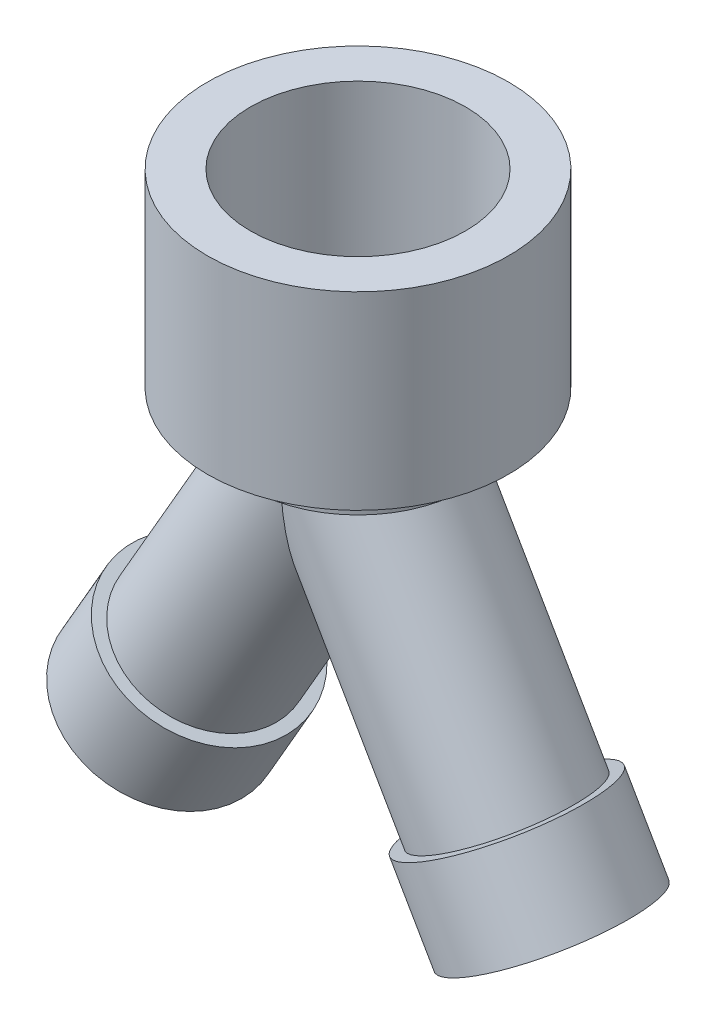
ISO-10303-21;
HEADER;
FILE_DESCRIPTION(('STEP AP214'),'2;1');
FILE_NAME('part.step','',(''),(''),'','','');
FILE_SCHEMA(('AUTOMOTIVE_DESIGN { 1 0 10303 214 1 1 1 1 }'));
ENDSEC;
DATA;
#1=APPLICATION_CONTEXT('core data for automotive mechanical design processes');
#2=APPLICATION_PROTOCOL_DEFINITION('international standard','automotive_design',2000,#1);
#3=PRODUCT_CONTEXT('',#1,'mechanical');
#4=PRODUCT('Part','Part','',(#3));
#5=PRODUCT_RELATED_PRODUCT_CATEGORY('part','',(#4));
#6=PRODUCT_DEFINITION_FORMATION('','',#4);
#7=PRODUCT_DEFINITION_CONTEXT('part definition',#1,'design');
#8=PRODUCT_DEFINITION('design','',#6,#7);
#9=PRODUCT_DEFINITION_SHAPE('','',#8);
#10=(LENGTH_UNIT() NAMED_UNIT(*) SI_UNIT(.MILLI.,.METRE.));
#11=(NAMED_UNIT(*) PLANE_ANGLE_UNIT() SI_UNIT($,.RADIAN.));
#12=(NAMED_UNIT(*) SI_UNIT($,.STERADIAN.) SOLID_ANGLE_UNIT());
#13=UNCERTAINTY_MEASURE_WITH_UNIT(LENGTH_MEASURE(1.E-05),#10,'distance_accuracy_value','');
#14=(GEOMETRIC_REPRESENTATION_CONTEXT(3) GLOBAL_UNCERTAINTY_ASSIGNED_CONTEXT((#13)) GLOBAL_UNIT_ASSIGNED_CONTEXT((#10,
#11,#12)) REPRESENTATION_CONTEXT('',''));
#15=CARTESIAN_POINT('',(0.,0.,0.));
#16=DIRECTION('',(0.,0.,1.));
#17=DIRECTION('',(1.,0.,0.));
#18=AXIS2_PLACEMENT_3D('',#15,#16,#17);
#19=CARTESIAN_POINT('',(0.,-7.62,0.));
#20=DIRECTION('',(-0.500000000000001,0.866025403784438,0.));
#21=DIRECTION('',(0.866025403784438,0.500000000000001,0.));
#22=AXIS2_PLACEMENT_3D('',#19,#20,#21);
#23=CYLINDRICAL_SURFACE('',#22,11.43);
#24=CARTESIAN_POINT('',(0.,-7.62,0.));
#25=DIRECTION('',(0.,-1.,0.));
#26=DIRECTION('',(-1.,0.,0.));
#27=AXIS2_PLACEMENT_3D('',#24,#25,#26);
#28=ELLIPSE('',#27,13.1982271536749,11.43);
#29=CARTESIAN_POINT('',(0.,-7.62,-11.43));
#30=VERTEX_POINT('',#29);
#31=CARTESIAN_POINT('',(0.,-7.62000000000002,11.43));
#32=VERTEX_POINT('',#31);
#33=EDGE_CURVE('E86',#30,#32,#28,.T.);
#34=ORIENTED_EDGE('',*,*,#33,.T.);
#35=CARTESIAN_POINT('',(0.,-7.62,0.));
#36=DIRECTION('',(1.,0.,0.));
#37=DIRECTION('',(0.,1.,0.));
#38=AXIS2_PLACEMENT_3D('',#35,#36,#37);
#39=ELLIPSE('',#38,22.86,11.43);
#40=EDGE_CURVE('E91',#32,#30,#39,.T.);
#41=ORIENTED_EDGE('',*,*,#40,.T.);
#42=EDGE_LOOP('',(#34,#41));
#43=FACE_BOUND('',#42,.T.);
#44=CARTESIAN_POINT('',(21.9710000000001,-45.6748882930958,0.));
#45=DIRECTION('',(-0.500000000000001,0.866025403784438,0.));
#46=DIRECTION('',(-0.866025403784438,-0.500000000000001,0.));
#47=AXIS2_PLACEMENT_3D('',#44,#45,#46);
#48=CIRCLE('',#47,11.43);
#49=CARTESIAN_POINT('',(12.0723296347439,-51.3898882930958,0.));
#50=VERTEX_POINT('',#49);
#51=EDGE_CURVE('E347',#50,#50,#48,.T.);
#52=ORIENTED_EDGE('',*,*,#51,.T.);
#53=EDGE_LOOP('',(#52));
#54=FACE_BOUND('',#53,.T.);
#55=ADVANCED_FACE('F34',(#43,#54),#23,.T.);
#56=CARTESIAN_POINT('',(0.,-7.62,0.));
#57=DIRECTION('',(0.500000000000001,0.866025403784438,0.));
#58=DIRECTION('',(-0.866025403784438,0.500000000000001,0.));
#59=AXIS2_PLACEMENT_3D('',#56,#57,#58);
#60=CYLINDRICAL_SURFACE('',#59,11.43);
#61=ORIENTED_EDGE('',*,*,#40,.F.);
#62=CARTESIAN_POINT('',(0.,-7.62,0.));
#63=DIRECTION('',(0.,-1.,0.));
#64=DIRECTION('',(1.,0.,0.));
#65=AXIS2_PLACEMENT_3D('',#62,#63,#64);
#66=ELLIPSE('',#65,13.1982271536749,11.43);
#67=EDGE_CURVE('E82',#32,#30,#66,.T.);
#68=ORIENTED_EDGE('',*,*,#67,.T.);
#69=EDGE_LOOP('',(#61,#68));
#70=FACE_BOUND('',#69,.T.);
#71=CARTESIAN_POINT('',(-21.9710000000001,-45.6748882930958,0.));
#72=DIRECTION('',(-0.500000000000001,-0.866025403784438,0.));
#73=DIRECTION('',(0.866025403784438,-0.500000000000001,0.));
#74=AXIS2_PLACEMENT_3D('',#71,#72,#73);
#75=CIRCLE('',#74,11.43);
#76=CARTESIAN_POINT('',(-12.0723296347439,-51.3898882930958,0.));
#77=VERTEX_POINT('',#76);
#78=EDGE_CURVE('E95',#77,#77,#75,.T.);
#79=ORIENTED_EDGE('',*,*,#78,.F.);
#80=EDGE_LOOP('',(#79));
#81=FACE_BOUND('',#80,.T.);
#82=ADVANCED_FACE('F92',(#70,#81),#60,.T.);
#83=CARTESIAN_POINT('',(0.,-7.62,0.));
#84=DIRECTION('',(0.,-1.,0.));
#85=DIRECTION('',(0.,0.,-1.));
#86=AXIS2_PLACEMENT_3D('',#83,#84,#85);
#87=PLANE('',#86);
#88=CARTESIAN_POINT('',(0.,-7.62,0.));
#89=DIRECTION('',(0.,-1.,0.));
#90=DIRECTION('',(0.,0.,-1.));
#91=AXIS2_PLACEMENT_3D('',#88,#89,#90);
#92=CIRCLE('',#91,15.875);
#93=CARTESIAN_POINT('',(0.,-7.62,-15.875));
#94=VERTEX_POINT('',#93);
#95=EDGE_CURVE('E122',#94,#94,#92,.T.);
#96=ORIENTED_EDGE('',*,*,#95,.T.);
#97=EDGE_LOOP('',(#96));
#98=FACE_BOUND('',#97,.T.);
#99=ORIENTED_EDGE('',*,*,#33,.F.);
#100=ORIENTED_EDGE('',*,*,#67,.F.);
#101=EDGE_LOOP('',(#99,#100));
#102=FACE_BOUND('',#101,.T.);
#103=ADVANCED_FACE('F84',(#98,#102),#87,.T.);
#104=CARTESIAN_POINT('',(0.,-7.62,0.));
#105=DIRECTION('',(0.,-1.,0.));
#106=DIRECTION('',(-1.,0.,0.));
#107=AXIS2_PLACEMENT_3D('',#104,#105,#106);
#108=ELLIPSE('',#107,8.7988181024499,7.62);
#109=CARTESIAN_POINT('',(0.,-7.62,7.62));
#110=VERTEX_POINT('',#109);
#111=CARTESIAN_POINT('',(0.,-7.62,-7.62));
#112=VERTEX_POINT('',#111);
#113=EDGE_CURVE('E98',#110,#112,#108,.F.);
#114=ORIENTED_EDGE('',*,*,#113,.F.);
#115=CARTESIAN_POINT('',(0.,-7.62,0.));
#116=DIRECTION('',(0.,-1.,0.));
#117=DIRECTION('',(1.,0.,0.));
#118=AXIS2_PLACEMENT_3D('',#115,#116,#117);
#119=ELLIPSE('',#118,8.7988181024499,7.62);
#120=EDGE_CURVE('E54',#112,#110,#119,.F.);
#121=ORIENTED_EDGE('',*,*,#120,.F.);
#122=EDGE_LOOP('',(#114,#121));
#123=FACE_BOUND('',#122,.T.);
#124=ADVANCED_FACE('F215',(#123),#87,.T.);
#125=CARTESIAN_POINT('',(0.,-7.62,0.));
#126=DIRECTION('',(0.500000000000001,0.866025403784438,0.));
#127=DIRECTION('',(-0.866025403784438,0.500000000000001,0.));
#128=AXIS2_PLACEMENT_3D('',#125,#126,#127);
#129=CYLINDRICAL_SURFACE('',#128,7.62);
#130=CARTESIAN_POINT('',(-8.51941899427419,-12.5386888496834,-5.81987113259394));
#131=CARTESIAN_POINT('',(-8.40017942948958,-12.6075320668946,-5.93627103688453));
#132=CARTESIAN_POINT('',(-8.2785579120609,-12.6806397600646,-6.04777155656926));
#133=CARTESIAN_POINT('',(-8.0319777803417,-12.8359990953302,-6.26040021709131));
#134=CARTESIAN_POINT('',(-7.90701714628562,-12.9182563715162,-6.36152189238391));
#135=CARTESIAN_POINT('',(-7.65531876025398,-13.0924586329775,-6.55268735287305));
#136=CARTESIAN_POINT('',(-7.52858075353579,-13.1844050195082,-6.64272953164105));
#137=CARTESIAN_POINT('',(-7.27505864616871,-13.3783163962796,-6.81114687420383));
#138=CARTESIAN_POINT('',(-7.14827456321832,-13.4802790397259,-6.88952476015316));
#139=CARTESIAN_POINT('',(-6.89579272943722,-13.6948307214968,-7.03455580648421));
#140=CARTESIAN_POINT('',(-6.77010267233761,-13.8074665432574,-7.10115329814647));
#141=CARTESIAN_POINT('',(-6.5221335170095,-14.0427129984152,-7.22196737448821));
#142=CARTESIAN_POINT('',(-6.39985459781527,-14.1653241540521,-7.27618331038847));
#143=CARTESIAN_POINT('',(-6.16049526228697,-14.4196452664246,-7.37218712362938));
#144=CARTESIAN_POINT('',(-6.04340564854408,-14.551337973402,-7.41399780391877));
#145=CARTESIAN_POINT('',(-5.81542781439078,-14.823061112812,-7.48564455094343));
#146=CARTESIAN_POINT('',(-5.70453949831271,-14.9630914165513,-7.51548080245253));
#147=CARTESIAN_POINT('',(-5.49488735856831,-15.2435182801368,-7.56259628753768));
#148=CARTESIAN_POINT('',(-5.39579815125564,-15.3835843568723,-7.58040262331333));
#149=CARTESIAN_POINT('',(-5.20440232065841,-15.6690868560957,-7.6062780458078));
#150=CARTESIAN_POINT('',(-5.11209542714253,-15.8145230642711,-7.61434752067531));
#151=CARTESIAN_POINT('',(-4.84523755877699,-16.2577386246212,-7.62499409428589));
#152=CARTESIAN_POINT('',(-4.68095695406543,-16.5621439558835,-7.61396553064916));
#153=CARTESIAN_POINT('',(-4.40111607242368,-17.1336069626633,-7.56506106570286));
#154=CARTESIAN_POINT('',(-4.28194504063687,-17.3993486486677,-7.53149871250967));
#155=CARTESIAN_POINT('',(-4.05977193520259,-17.934534346516,-7.44479538761356));
#156=CARTESIAN_POINT('',(-3.95678052485687,-18.2039806737919,-7.39164158057976));
#157=CARTESIAN_POINT('',(-3.76455435244691,-18.7443751019539,-7.2675249486645));
#158=CARTESIAN_POINT('',(-3.67535436660525,-19.0153252703397,-7.1965182519986));
#159=CARTESIAN_POINT('',(-3.50888471265602,-19.5559535217516,-7.03799927220274));
#160=CARTESIAN_POINT('',(-3.43161268965761,-19.8256318456547,-6.9504902546598));
#161=CARTESIAN_POINT('',(-3.28305357814247,-20.3772502333311,-6.75415395469521));
#162=CARTESIAN_POINT('',(-3.21235490111182,-20.6590177504815,-6.64439876071401));
#163=CARTESIAN_POINT('',(-3.08045128484155,-21.2173476343578,-6.40723150190542));
#164=CARTESIAN_POINT('',(-3.01924787539957,-21.4939091560439,-6.27981659814214));
#165=CARTESIAN_POINT('',(-2.9050525591312,-22.0393022785146,-6.00713359392627));
#166=CARTESIAN_POINT('',(-2.8520482896504,-22.3081450091881,-5.86189297602301));
#167=CARTESIAN_POINT('',(-2.75309663345149,-22.8360746242365,-5.55256166840523));
#168=CARTESIAN_POINT('',(-2.70714702294742,-23.0951645633901,-5.38847694739952));
#169=CARTESIAN_POINT('',(-2.63391869310217,-23.5274439586179,-5.0905660251703));
#170=CARTESIAN_POINT('',(-2.60508360497737,-23.7038049509703,-4.96171404207057));
#171=CARTESIAN_POINT('',(-2.55040203058366,-24.0486481332719,-4.69330664692774));
#172=CARTESIAN_POINT('',(-2.52455490400012,-24.2171320066468,-4.55375353881789));
#173=CARTESIAN_POINT('',(-2.4757296131572,-24.5444574693886,-4.26340166219648));
#174=CARTESIAN_POINT('',(-2.45274981930812,-24.7033045090327,-4.11260935981211));
#175=CARTESIAN_POINT('',(-2.40959866978484,-25.0092318032009,-3.79927002573292));
#176=CARTESIAN_POINT('',(-2.38942654747967,-25.1563152650699,-3.636726221261));
#177=CARTESIAN_POINT('',(-2.34228143545645,-25.5078496805895,-3.21291902696543));
#178=CARTESIAN_POINT('',(-2.31709694260628,-25.7032332287429,-2.94363585052347));
#179=CARTESIAN_POINT('',(-2.28444395454271,-25.9629441305366,-2.51926877659305));
#180=CARTESIAN_POINT('',(-2.27441513730816,-26.0439403140501,-2.37443828308655));
#181=CARTESIAN_POINT('',(-2.25613560171803,-26.1932140071708,-2.07829408965303));
#182=CARTESIAN_POINT('',(-2.24788369038468,-26.2615000459022,-1.92698482177491));
#183=CARTESIAN_POINT('',(-2.23465866880768,-26.3718929656371,-1.64837089416059));
#184=CARTESIAN_POINT('',(-2.22936011718093,-26.4165088210217,-1.52207251049131));
#185=CARTESIAN_POINT('',(-2.22002668231745,-26.4955328344641,-1.26632079404892));
#186=CARTESIAN_POINT('',(-2.21599118276735,-26.5299459705625,-1.13686903332569));
#187=CARTESIAN_POINT('',(-2.20922657732926,-26.5878476087961,-0.875560906028385));
#188=CARTESIAN_POINT('',(-2.20649689184307,-26.6113409576529,-0.743705633305396));
#189=CARTESIAN_POINT('',(-2.20237496742531,-26.6468846116194,-0.478430953745714));
#190=CARTESIAN_POINT('',(-2.20098274068815,-26.6589348123949,-0.345011532658952));
#191=CARTESIAN_POINT('',(-2.19955266904437,-26.6713131334057,-0.0772668733876903));
#192=CARTESIAN_POINT('',(-2.19951840061059,-26.6716102995133,0.0570598249673243));
#193=CARTESIAN_POINT('',(-2.20081361479246,-26.660398272781,0.325208860330016));
#194=CARTESIAN_POINT('',(-2.20214310177991,-26.6488890420932,0.459031195719471));
#195=CARTESIAN_POINT('',(-2.20614877022777,-26.6143384858591,0.725183394161435));
#196=CARTESIAN_POINT('',(-2.20882521842862,-26.5912948761498,0.857512956289216));
#197=CARTESIAN_POINT('',(-2.21549077442589,-26.5342189804016,1.11976572463905));
#198=CARTESIAN_POINT('',(-2.21948042386641,-26.5001821602023,1.24968791451812));
#199=CARTESIAN_POINT('',(-2.23310158327126,-26.3847873950189,1.6275371419668));
#200=CARTESIAN_POINT('',(-2.24450446757909,-26.2890827703448,1.8711348361194));
#201=CARTESIAN_POINT('',(-2.2717441211475,-26.0652349129426,2.34230555727956));
#202=CARTESIAN_POINT('',(-2.28758272732988,-25.9370782432803,2.56987189641185));
#203=CARTESIAN_POINT('',(-2.33511712496581,-25.562342070231,3.15095627171628));
#204=CARTESIAN_POINT('',(-2.37041332890216,-25.2930857499475,3.48966296712925));
#205=CARTESIAN_POINT('',(-2.43137822175831,-24.8535862888172,3.96264517824189));
#206=CARTESIAN_POINT('',(-2.45308242647192,-24.7008469287992,4.11469874976094));
#207=CARTESIAN_POINT('',(-2.49923574870482,-24.3854203993979,4.40774547192569));
#208=CARTESIAN_POINT('',(-2.52368473118528,-24.2227337195867,4.54873916612106));
#209=CARTESIAN_POINT('',(-2.59014099193766,-23.7943079018096,4.89742575527299));
#210=CARTESIAN_POINT('',(-2.63422159088003,-23.5226172919148,5.09740650490863));
#211=CARTESIAN_POINT('',(-2.73005372984235,-22.9643778447901,5.47346557157762));
#212=CARTESIAN_POINT('',(-2.78180986219794,-22.6778201796736,5.64952945728434));
#213=CARTESIAN_POINT('',(-2.89423906967058,-22.0928421921238,5.97976316134734));
#214=CARTESIAN_POINT('',(-2.954940071648,-21.7943869339336,6.13386132323062));
#215=CARTESIAN_POINT('',(-3.08663962990545,-21.1895961214393,6.42045813688383));
#216=CARTESIAN_POINT('',(-3.1576359095376,-20.8832623216462,6.55296155028904));
#217=CARTESIAN_POINT('',(-3.31572674935203,-20.2501464485967,6.80268262284871));
#218=CARTESIAN_POINT('',(-3.40343883513549,-19.9230970533179,6.91883569762626));
#219=CARTESIAN_POINT('',(-3.59547094498318,-19.2659878915945,7.12717366448659));
#220=CARTESIAN_POINT('',(-3.69979869357614,-18.9359267926376,7.21934735594233));
#221=CARTESIAN_POINT('',(-3.92818728736481,-18.2780889709146,7.37738621761769));
#222=CARTESIAN_POINT('',(-4.05215086712824,-17.9503088938581,7.44337572021049));
#223=CARTESIAN_POINT('',(-4.3242558063588,-17.3003580924195,7.54624602802899));
#224=CARTESIAN_POINT('',(-4.4723661238076,-16.9781807462649,7.58316385591131));
#225=CARTESIAN_POINT('',(-4.71938542307132,-16.4962074015014,7.61352712147449));
#226=CARTESIAN_POINT('',(-4.80824538230221,-16.3319750858687,7.61929256764205));
#227=CARTESIAN_POINT('',(-4.99392545662947,-16.008061997111,7.62058499319613));
#228=CARTESIAN_POINT('',(-5.09074244992132,-15.8483794717554,7.61611596958691));
#229=CARTESIAN_POINT('',(-5.29222028284009,-15.5351326548311,7.59608038014082));
#230=CARTESIAN_POINT('',(-5.39686695932511,-15.3815580503927,7.58053343866651));
#231=CARTESIAN_POINT('',(-5.61381174153555,-15.0816165975202,7.53753701774467));
#232=CARTESIAN_POINT('',(-5.72610980191901,-14.9352497063822,7.51008760882578));
#233=CARTESIAN_POINT('',(-5.95836374638266,-14.6500678999358,7.44238291702009));
#234=CARTESIAN_POINT('',(-6.07836743795442,-14.5113125563038,7.40203993902175));
#235=CARTESIAN_POINT('',(-6.32404250805145,-14.2435999159232,7.30817949777214));
#236=CARTESIAN_POINT('',(-6.44971409118547,-14.1146429733451,7.25466155859828));
#237=CARTESIAN_POINT('',(-6.70529607597359,-13.8670792021902,7.13422337690584));
#238=CARTESIAN_POINT('',(-6.83521426859991,-13.7484930557922,7.06727719233802));
#239=CARTESIAN_POINT('',(-7.09713311340043,-13.5223212978296,6.92024399017082));
#240=CARTESIAN_POINT('',(-7.22913344441728,-13.4147340085436,6.84015898158369));
#241=CARTESIAN_POINT('',(-7.45978696506962,-13.2363584885328,6.6891991771274));
#242=CARTESIAN_POINT('',(-7.55842260260702,-13.1631493783727,6.62112519781354));
#243=CARTESIAN_POINT('',(-7.75496712362565,-13.0226626102802,6.47814849569231));
#244=CARTESIAN_POINT('',(-7.85287602113015,-12.9553848376218,6.4032459050232));
#245=CARTESIAN_POINT('',(-8.04687349247121,-12.82676141834,6.24716366747045));
#246=CARTESIAN_POINT('',(-8.14296712061814,-12.7653963942678,6.16600621103826));
#247=CARTESIAN_POINT('',(-8.33298637886158,-12.6480654850999,5.99750420145765));
#248=CARTESIAN_POINT('',(-8.42691220484306,-12.5920991107117,5.91016021025634));
#249=CARTESIAN_POINT('',(-8.51941899427419,-12.5386888496834,5.81987113259394));
#250=B_SPLINE_CURVE_WITH_KNOTS('',3,(#130,#131,#132,#133,#134,#135,#136,#137,#138,#139,#140,
#141,#142,#143,#144,#145,#146,#147,#148,#149,#150,#151,#152,#153,#154,#155,#156,#157,#158,#159,
#160,#161,#162,#163,#164,#165,#166,#167,#168,#169,#170,#171,#172,#173,#174,#175,#176,#177,#178,
#179,#180,#181,#182,#183,#184,#185,#186,#187,#188,#189,#190,#191,#192,#193,#194,#195,#196,#197,
#198,#199,#200,#201,#202,#203,#204,#205,#206,#207,#208,#209,#210,#211,#212,#213,#214,#215,#216,
#217,#218,#219,#220,#221,#222,#223,#224,#225,#226,#227,#228,#229,#230,#231,#232,#233,#234,#235,
#236,#237,#238,#239,#240,#241,#242,#243,#244,#245,#246,#247,#248,#249),.UNSPECIFIED.,.F.,.F.,(4,
2,2,2,2,2,2,2,2,2,2,2,2,2,2,2,2,2,2,2,2,2,2,2,2,2,2,2,2,2,2,2,2,2,2,2,2,2,2,2,2,2,2,2,2,2,2,2,2,
2,2,2,2,2,2,2,2,2,2,4),(0.,0.540816795290946,1.08196847553122,1.62319852573192,2.16430206761653,
2.70789801189161,3.25152243343428,3.79414130120492,4.33675179566367,4.85370196412901,
5.37063152429311,6.40553682718327,7.28389238226154,8.16282441737172,9.04393782387079,
9.92487705251378,10.8558040342592,11.7868808437219,12.7165397973495,13.6459050973743,
14.3064765727478,14.966906225422,15.6269588101103,16.2868308132716,17.2837242140043,
17.781963687424,18.279867602978,18.6816319858098,19.0832000187025,19.4845896459782,
19.8859829329334,20.2884333046582,20.6908849665266,21.0934163577895,21.4961139859834,
22.2787922629492,23.0617951432611,24.3561970267105,25.0057137016178,25.655198435298,
26.6743489357585,27.6941116810497,28.7171284776053,29.7399193931861,30.8127344710474,
31.8860497583602,32.9542057376369,34.0209992148881,34.5810393659236,35.140860834296,
35.6996930451473,36.2585219446568,36.8212356119043,37.3839696091888,37.9478014094876,
38.5115470764251,38.9325780031763,39.353600784422,39.7731931685709,40.1927474882629),.UNSPECIFIED.);
#251=CARTESIAN_POINT('',(-8.51941899427423,-12.5386888496835,-5.81987113259391));
#252=VERTEX_POINT('',#251);
#253=CARTESIAN_POINT('',(-8.51941899427423,-12.5386888496835,5.81987113259391));
#254=VERTEX_POINT('',#253);
#255=EDGE_CURVE('E11',#252,#254,#250,.T.);
#256=ORIENTED_EDGE('',*,*,#255,.F.);
#257=CARTESIAN_POINT('',(0.,-7.62000000000002,0.));
#258=DIRECTION('',(-0.500000000000001,0.866025403784438,0.));
#259=DIRECTION('',(0.866025403784438,0.500000000000001,0.));
#260=AXIS2_PLACEMENT_3D('',#257,#258,#259);
#261=ELLIPSE('',#260,15.2400000000001,7.62);
#262=EDGE_CURVE('E48',#112,#252,#261,.T.);
#263=ORIENTED_EDGE('',*,*,#262,.F.);
#264=ORIENTED_EDGE('',*,*,#120,.T.);
#265=EDGE_CURVE('E141',#254,#110,#261,.T.);
#266=ORIENTED_EDGE('',*,*,#265,.F.);
#267=EDGE_LOOP('',(#256,#263,#264,#266));
#268=FACE_BOUND('',#267,.T.);
#269=CARTESIAN_POINT('',(-28.575,-57.1133518262806,0.));
#270=DIRECTION('',(0.500000000000001,0.866025403784438,0.));
#271=DIRECTION('',(-0.866025403784438,0.500000000000001,0.));
#272=AXIS2_PLACEMENT_3D('',#269,#270,#271);
#273=CIRCLE('',#272,7.62);
#274=CARTESIAN_POINT('',(-35.1741135768375,-53.3033518262806,0.));
#275=VERTEX_POINT('',#274);
#276=EDGE_CURVE('E111',#275,#275,#273,.T.);
#277=ORIENTED_EDGE('',*,*,#276,.F.);
#278=EDGE_LOOP('',(#277));
#279=FACE_BOUND('',#278,.T.);
#280=ADVANCED_FACE('F200',(#268,#279),#129,.F.);
#281=CARTESIAN_POINT('',(0.,25.4,0.));
#282=DIRECTION('',(0.,1.,0.));
#283=DIRECTION('',(0.,0.,1.));
#284=AXIS2_PLACEMENT_3D('',#281,#282,#283);
#285=PLANE('',#284);
#286=CARTESIAN_POINT('',(0.,25.4,0.));
#287=DIRECTION('',(0.,1.,0.));
#288=DIRECTION('',(0.,0.,1.));
#289=AXIS2_PLACEMENT_3D('',#286,#287,#288);
#290=CIRCLE('',#289,22.225);
#291=CARTESIAN_POINT('',(0.,25.4,22.225));
#292=VERTEX_POINT('',#291);
#293=EDGE_CURVE('E129',#292,#292,#290,.T.);
#294=ORIENTED_EDGE('',*,*,#293,.T.);
#295=EDGE_LOOP('',(#294));
#296=FACE_BOUND('',#295,.T.);
#297=CARTESIAN_POINT('',(0.,25.4,0.));
#298=DIRECTION('',(0.,1.,0.));
#299=DIRECTION('',(0.,0.,1.));
#300=AXIS2_PLACEMENT_3D('',#297,#298,#299);
#301=CIRCLE('',#300,15.875);
#302=CARTESIAN_POINT('',(0.,25.4,15.875));
#303=VERTEX_POINT('',#302);
#304=EDGE_CURVE('E133',#303,#303,#301,.T.);
#305=ORIENTED_EDGE('',*,*,#304,.F.);
#306=EDGE_LOOP('',(#305));
#307=FACE_BOUND('',#306,.T.);
#308=ADVANCED_FACE('F237',(#296,#307),#285,.T.);
#309=CARTESIAN_POINT('',(0.,25.4,0.));
#310=DIRECTION('',(0.,-1.,0.));
#311=DIRECTION('',(0.,0.,-1.));
#312=AXIS2_PLACEMENT_3D('',#309,#310,#311);
#313=CYLINDRICAL_SURFACE('',#312,22.225);
#314=ORIENTED_EDGE('',*,*,#293,.F.);
#315=EDGE_LOOP('',(#314));
#316=FACE_BOUND('',#315,.T.);
#317=CARTESIAN_POINT('',(0.,-2.54,0.));
#318=DIRECTION('',(0.,-1.,0.));
#319=DIRECTION('',(0.,0.,-1.));
#320=AXIS2_PLACEMENT_3D('',#317,#318,#319);
#321=CIRCLE('',#320,22.225);
#322=CARTESIAN_POINT('',(0.,-2.54,-22.225));
#323=VERTEX_POINT('',#322);
#324=EDGE_CURVE('E125',#323,#323,#321,.T.);
#325=ORIENTED_EDGE('',*,*,#324,.F.);
#326=EDGE_LOOP('',(#325));
#327=FACE_BOUND('',#326,.T.);
#328=ADVANCED_FACE('F36',(#316,#327),#313,.T.);
#329=CARTESIAN_POINT('',(0.,25.4,0.));
#330=DIRECTION('',(0.,-1.,0.));
#331=DIRECTION('',(0.,0.,-1.));
#332=AXIS2_PLACEMENT_3D('',#329,#330,#331);
#333=CYLINDRICAL_SURFACE('',#332,15.875);
#334=ORIENTED_EDGE('',*,*,#304,.T.);
#335=EDGE_LOOP('',(#334));
#336=FACE_BOUND('',#335,.T.);
#337=CARTESIAN_POINT('',(0.,0.,0.));
#338=DIRECTION('',(0.,1.,0.));
#339=DIRECTION('',(0.,0.,1.));
#340=AXIS2_PLACEMENT_3D('',#337,#338,#339);
#341=CIRCLE('',#340,15.875);
#342=CARTESIAN_POINT('',(0.,0.,15.875));
#343=VERTEX_POINT('',#342);
#344=EDGE_CURVE('E132',#343,#343,#341,.T.);
#345=ORIENTED_EDGE('',*,*,#344,.F.);
#346=EDGE_LOOP('',(#345));
#347=FACE_BOUND('',#346,.T.);
#348=ADVANCED_FACE('F233',(#336,#347),#333,.F.);
#349=CARTESIAN_POINT('',(0.,0.,0.));
#350=DIRECTION('',(0.,-1.,0.));
#351=DIRECTION('',(0.,0.,-1.));
#352=AXIS2_PLACEMENT_3D('',#349,#350,#351);
#353=PLANE('',#352);
#354=ORIENTED_EDGE('',*,*,#344,.T.);
#355=EDGE_LOOP('',(#354));
#356=FACE_BOUND('',#355,.T.);
#357=ADVANCED_FACE('F229',(#356),#353,.F.);
#358=CARTESIAN_POINT('',(0.,-2.54,0.));
#359=DIRECTION('',(0.,-1.,0.));
#360=DIRECTION('',(0.,0.,-1.));
#361=AXIS2_PLACEMENT_3D('',#358,#359,#360);
#362=PLANE('',#361);
#363=CARTESIAN_POINT('',(0.,-2.54,0.));
#364=DIRECTION('',(0.,-1.,0.));
#365=DIRECTION('',(0.,0.,-1.));
#366=AXIS2_PLACEMENT_3D('',#363,#364,#365);
#367=CIRCLE('',#366,15.875);
#368=CARTESIAN_POINT('',(0.,-2.54,-15.875));
#369=VERTEX_POINT('',#368);
#370=EDGE_CURVE('E126',#369,#369,#367,.T.);
#371=ORIENTED_EDGE('',*,*,#370,.F.);
#372=EDGE_LOOP('',(#371));
#373=FACE_BOUND('',#372,.T.);
#374=ORIENTED_EDGE('',*,*,#324,.T.);
#375=EDGE_LOOP('',(#374));
#376=FACE_BOUND('',#375,.T.);
#377=ADVANCED_FACE('F225',(#373,#376),#362,.T.);
#378=CARTESIAN_POINT('',(0.,-7.62,0.));
#379=DIRECTION('',(0.,1.,0.));
#380=DIRECTION('',(0.,0.,1.));
#381=AXIS2_PLACEMENT_3D('',#378,#379,#380);
#382=CYLINDRICAL_SURFACE('',#381,15.875);
#383=ORIENTED_EDGE('',*,*,#95,.F.);
#384=EDGE_LOOP('',(#383));
#385=FACE_BOUND('',#384,.T.);
#386=ORIENTED_EDGE('',*,*,#370,.T.);
#387=EDGE_LOOP('',(#386));
#388=FACE_BOUND('',#387,.T.);
#389=ADVANCED_FACE('F222',(#385,#388),#382,.T.);
#390=CARTESIAN_POINT('',(-35.1741135768375,-53.3033518262806,0.));
#391=DIRECTION('',(-0.500000000000001,-0.866025403784438,0.));
#392=DIRECTION('',(0.866025403784438,-0.500000000000001,0.));
#393=AXIS2_PLACEMENT_3D('',#390,#391,#392);
#394=PLANE('',#393);
#395=ORIENTED_EDGE('',*,*,#276,.T.);
#396=EDGE_LOOP('',(#395));
#397=FACE_BOUND('',#396,.T.);
#398=CARTESIAN_POINT('',(-28.5750000000001,-57.1133518262807,0.));
#399=DIRECTION('',(-0.500000000000001,-0.866025403784438,0.));
#400=DIRECTION('',(0.866025403784438,-0.500000000000001,0.));
#401=AXIS2_PLACEMENT_3D('',#398,#399,#400);
#402=CIRCLE('',#401,13.1514087097476);
#403=CARTESIAN_POINT('',(-17.1855459618068,-63.6890561811545,0.));
#404=VERTEX_POINT('',#403);
#405=EDGE_CURVE('E107',#404,#404,#402,.T.);
#406=ORIENTED_EDGE('',*,*,#405,.T.);
#407=EDGE_LOOP('',(#406));
#408=FACE_BOUND('',#407,.T.);
#409=ADVANCED_FACE('F194',(#397,#408),#394,.T.);
#410=CARTESIAN_POINT('',(-21.9710000000001,-45.6748882930958,0.));
#411=DIRECTION('',(-0.500000000000001,-0.866025403784438,0.));
#412=DIRECTION('',(0.866025403784438,-0.500000000000001,0.));
#413=AXIS2_PLACEMENT_3D('',#410,#411,#412);
#414=CYLINDRICAL_SURFACE('',#413,13.1514087097476);
#415=CARTESIAN_POINT('',(-21.9710000000001,-45.6748882930958,0.));
#416=DIRECTION('',(-0.500000000000001,-0.866025403784438,0.));
#417=DIRECTION('',(0.866025403784438,-0.500000000000001,0.));
#418=AXIS2_PLACEMENT_3D('',#415,#416,#417);
#419=CIRCLE('',#418,13.1514087097476);
#420=CARTESIAN_POINT('',(-10.5815459618068,-52.2505926479696,0.));
#421=VERTEX_POINT('',#420);
#422=EDGE_CURVE('E108',#421,#421,#419,.T.);
#423=ORIENTED_EDGE('',*,*,#422,.T.);
#424=EDGE_LOOP('',(#423));
#425=FACE_BOUND('',#424,.T.);
#426=ORIENTED_EDGE('',*,*,#405,.F.);
#427=EDGE_LOOP('',(#426));
#428=FACE_BOUND('',#427,.T.);
#429=ADVANCED_FACE('F191',(#425,#428),#414,.T.);
#430=CARTESIAN_POINT('',(-21.9710000000001,-45.6748882930958,0.));
#431=DIRECTION('',(-0.500000000000001,-0.866025403784438,0.));
#432=DIRECTION('',(0.866025403784438,-0.500000000000001,0.));
#433=AXIS2_PLACEMENT_3D('',#430,#431,#432);
#434=PLANE('',#433);
#435=ORIENTED_EDGE('',*,*,#78,.T.);
#436=EDGE_LOOP('',(#435));
#437=FACE_BOUND('',#436,.T.);
#438=ORIENTED_EDGE('',*,*,#422,.F.);
#439=EDGE_LOOP('',(#438));
#440=FACE_BOUND('',#439,.T.);
#441=ADVANCED_FACE('F175',(#437,#440),#434,.F.);
#442=CARTESIAN_POINT('',(0.,-7.62,0.));
#443=DIRECTION('',(-0.500000000000001,0.866025403784438,0.));
#444=DIRECTION('',(0.866025403784438,0.500000000000001,0.));
#445=AXIS2_PLACEMENT_3D('',#442,#443,#444);
#446=CYLINDRICAL_SURFACE('',#445,7.62);
#447=CARTESIAN_POINT('',(0.,-7.62,0.));
#448=DIRECTION('',(0.500000000000001,-0.866025403784438,0.));
#449=DIRECTION('',(0.866025403784438,0.500000000000001,0.));
#450=AXIS2_PLACEMENT_3D('',#447,#448,#449);
#451=CIRCLE('',#450,7.62);
#452=EDGE_CURVE('E61',#110,#112,#451,.T.);
#453=ORIENTED_EDGE('',*,*,#452,.F.);
#454=CARTESIAN_POINT('',(0.,-7.62,0.));
#455=DIRECTION('',(1.,0.,0.));
#456=DIRECTION('',(0.,1.,0.));
#457=AXIS2_PLACEMENT_3D('',#454,#455,#456);
#458=ELLIPSE('',#457,15.24,7.62);
#459=EDGE_CURVE('E89',#110,#112,#458,.T.);
#460=ORIENTED_EDGE('',*,*,#459,.T.);
#461=EDGE_LOOP('',(#453,#460));
#462=FACE_BOUND('',#461,.T.);
#463=ADVANCED_FACE('F170',(#462),#446,.F.);
#464=CARTESIAN_POINT('',(9.89867036525617,-1.90499999999997,0.));
#465=DIRECTION('',(-0.500000000000001,0.866025403784438,0.));
#466=DIRECTION('',(0.866025403784438,0.500000000000001,0.));
#467=AXIS2_PLACEMENT_3D('',#464,#465,#466);
#468=PLANE('',#467);
#469=ORIENTED_EDGE('',*,*,#452,.T.);
#470=ORIENTED_EDGE('',*,*,#262,.T.);
#471=CARTESIAN_POINT('',(0.,-7.62000000000001,0.));
#472=DIRECTION('',(0.500000000000001,-0.866025403784438,0.));
#473=DIRECTION('',(0.866025403784438,0.500000000000001,0.));
#474=AXIS2_PLACEMENT_3D('',#471,#472,#473);
#475=CIRCLE('',#474,11.43);
#476=EDGE_CURVE('E148',#254,#252,#475,.T.);
#477=ORIENTED_EDGE('',*,*,#476,.F.);
#478=ORIENTED_EDGE('',*,*,#265,.T.);
#479=EDGE_LOOP('',(#469,#470,#477,#478));
#480=FACE_BOUND('',#479,.T.);
#481=ADVANCED_FACE('F147',(#480),#468,.T.);
#482=ORIENTED_EDGE('',*,*,#476,.T.);
#483=ORIENTED_EDGE('',*,*,#255,.T.);
#484=EDGE_LOOP('',(#482,#483));
#485=FACE_BOUND('',#484,.T.);
#486=ADVANCED_FACE('F151',(#485),#23,.T.);
#487=ORIENTED_EDGE('',*,*,#459,.F.);
#488=CARTESIAN_POINT('',(0.,-7.62,0.));
#489=DIRECTION('',(0.500000000000001,0.866025403784438,0.));
#490=DIRECTION('',(-0.866025403784438,0.500000000000001,0.));
#491=AXIS2_PLACEMENT_3D('',#488,#489,#490);
#492=CIRCLE('',#491,7.62);
#493=EDGE_CURVE('E116',#110,#112,#492,.T.);
#494=ORIENTED_EDGE('',*,*,#493,.T.);
#495=EDGE_LOOP('',(#487,#494));
#496=FACE_BOUND('',#495,.T.);
#497=ADVANCED_FACE('F183',(#496),#129,.F.);
#498=CARTESIAN_POINT('',(-9.89867036525617,-1.90499999999997,0.));
#499=DIRECTION('',(0.500000000000001,0.866025403784438,0.));
#500=DIRECTION('',(-0.866025403784438,0.500000000000001,0.));
#501=AXIS2_PLACEMENT_3D('',#498,#499,#500);
#502=PLANE('',#501);
#503=CARTESIAN_POINT('',(0.,-7.62000000000002,0.));
#504=DIRECTION('',(0.500000000000001,0.866025403784438,0.));
#505=DIRECTION('',(-0.866025403784438,0.500000000000001,0.));
#506=AXIS2_PLACEMENT_3D('',#503,#504,#505);
#507=ELLIPSE('',#506,15.2400000000001,7.62);
#508=CARTESIAN_POINT('',(8.51941899427423,-12.5386888496835,-5.81987113259391));
#509=VERTEX_POINT('',#508);
#510=EDGE_CURVE('E155',#112,#509,#507,.F.);
#511=ORIENTED_EDGE('',*,*,#510,.F.);
#512=ORIENTED_EDGE('',*,*,#493,.F.);
#513=CARTESIAN_POINT('',(8.51941899427423,-12.5386888496835,5.81987113259391));
#514=VERTEX_POINT('',#513);
#515=EDGE_CURVE('E152',#514,#110,#507,.F.);
#516=ORIENTED_EDGE('',*,*,#515,.F.);
#517=CARTESIAN_POINT('',(0.,-7.62000000000001,0.));
#518=DIRECTION('',(0.500000000000001,0.866025403784438,0.));
#519=DIRECTION('',(-0.866025403784438,0.500000000000001,0.));
#520=AXIS2_PLACEMENT_3D('',#517,#518,#519);
#521=CIRCLE('',#520,11.43);
#522=EDGE_CURVE('E119',#514,#509,#521,.T.);
#523=ORIENTED_EDGE('',*,*,#522,.T.);
#524=EDGE_LOOP('',(#511,#512,#516,#523));
#525=FACE_BOUND('',#524,.T.);
#526=ADVANCED_FACE('F198',(#525),#502,.T.);
#527=CARTESIAN_POINT('',(10.9985226280624,-11.43,0.));
#528=CARTESIAN_POINT('',(10.9985267715504,-11.4300008099348,-0.212775663700345));
#529=CARTESIAN_POINT('',(10.9899409346454,-11.4329664434022,-0.425508468845973));
#530=CARTESIAN_POINT('',(10.9557131615794,-11.4448776652281,-0.84949508038465));
#531=CARTESIAN_POINT('',(10.9300676829807,-11.4538244955851,-1.06074857038897));
#532=CARTESIAN_POINT('',(10.8620084341282,-11.4778467318817,-1.48035598536519));
#533=CARTESIAN_POINT('',(10.8195807603237,-11.4929272196681,-1.68870735747845));
#534=CARTESIAN_POINT('',(10.7184932294534,-11.529453179401,-2.10085270135922));
#535=CARTESIAN_POINT('',(10.6598341588431,-11.5508983429653,-2.30464689341759));
#536=CARTESIAN_POINT('',(10.5270923834208,-11.6004655122499,-2.70602055934541));
#537=CARTESIAN_POINT('',(10.4530292768692,-11.6285790402593,-2.90360756633626));
#538=CARTESIAN_POINT('',(10.2903364173888,-11.6919555905334,-3.29150540889467));
#539=CARTESIAN_POINT('',(10.2017064421809,-11.7272187218973,-3.48181613337721));
#540=CARTESIAN_POINT('',(10.0109284507513,-11.8054895641592,-3.85394492772123));
#541=CARTESIAN_POINT('',(9.90877674624644,-11.8484993892592,-4.03576066205561));
#542=CARTESIAN_POINT('',(9.69221937995771,-11.9429784934184,-4.38963960445666));
#543=CARTESIAN_POINT('',(9.57781361249235,-11.9944478454362,-4.56170272839528));
#544=CARTESIAN_POINT('',(9.33677963521068,-12.1073596350932,-4.89685524931493));
#545=CARTESIAN_POINT('',(9.21002460851516,-12.1689112303564,-5.05981681356725));
#546=CARTESIAN_POINT('',(8.94712688181313,-12.3025744980737,-5.37339482664321));
#547=CARTESIAN_POINT('',(8.81098391259124,-12.3746864734316,-5.52401092116798));
#548=CARTESIAN_POINT('',(8.5313354316628,-12.5305423531352,-5.81165878836896));
#549=CARTESIAN_POINT('',(8.38783344545866,-12.6142807198278,-5.94869697526895));
#550=CARTESIAN_POINT('',(8.09566968276937,-12.7945216000561,-6.20811421487068));
#551=CARTESIAN_POINT('',(7.94700838267171,-12.8910229374181,-6.33049461638518));
#552=CARTESIAN_POINT('',(7.6554641220584,-13.0919817798375,-6.55313071883501));
#553=CARTESIAN_POINT('',(7.51272112490764,-13.1956956972396,-6.65423955079174));
#554=CARTESIAN_POINT('',(7.22732390952474,-13.4158764018863,-6.84163912712865));
#555=CARTESIAN_POINT('',(7.0846696858209,-13.5323423039616,-6.92793089895724));
#556=CARTESIAN_POINT('',(6.80214443113515,-13.7779196999549,-7.08503056807767));
#557=CARTESIAN_POINT('',(6.66226969673457,-13.9070127896044,-7.15586052818126));
#558=CARTESIAN_POINT('',(6.38748825222491,-14.1774771650972,-7.2819797740158));
#559=CARTESIAN_POINT('',(6.25258098710759,-14.3188470733054,-7.33727080049594));
#560=CARTESIAN_POINT('',(6.00778912690745,-14.59261036733,-7.42600427854809));
#561=CARTESIAN_POINT('',(5.89700921696153,-14.7235783801834,-7.46140262904184));
#562=CARTESIAN_POINT('',(5.68162972366791,-14.9928627379835,-7.52119071630888));
#563=CARTESIAN_POINT('',(5.57702938397968,-15.1311781796991,-7.54558180273816));
#564=CARTESIAN_POINT('',(5.37456286058067,-15.4141291308477,-7.58394107546711));
#565=CARTESIAN_POINT('',(5.27670022826871,-15.5587679085864,-7.59790380266024));
#566=CARTESIAN_POINT('',(5.08800977757546,-15.8531736850041,-7.61607878410728));
#567=CARTESIAN_POINT('',(4.99718389034141,-16.0029420752936,-7.62028837083043));
#568=CARTESIAN_POINT('',(4.7834129602395,-16.3745433015309,-7.61954480175838));
#569=CARTESIAN_POINT('',(4.66431631424768,-16.5985909713458,-7.60963958322289));
#570=CARTESIAN_POINT('',(4.43999823285084,-17.0521838254394,-7.57301615673298));
#571=CARTESIAN_POINT('',(4.33478314623387,-17.281731468834,-7.54629028780715));
#572=CARTESIAN_POINT('',(4.13657269453484,-17.7446507508781,-7.4777061022188));
#573=CARTESIAN_POINT('',(4.04361739623518,-17.9780322549527,-7.43579976738136));
#574=CARTESIAN_POINT('',(3.86882390541299,-18.4460092393214,-7.3382535350538));
#575=CARTESIAN_POINT('',(3.78698541023897,-18.6806046863857,-7.28261401156168));
#576=CARTESIAN_POINT('',(3.5953976902583,-19.2638735912964,-7.12834896910318));
#577=CARTESIAN_POINT('',(3.49148003369668,-19.6124321530774,-7.02198838909164));
#578=CARTESIAN_POINT('',(3.30079395850774,-20.3052361895494,-6.78274021431182));
#579=CARTESIAN_POINT('',(3.21403592629158,-20.6494789346177,-6.64983665075922));
#580=CARTESIAN_POINT('',(3.05456414746442,-21.3297423973347,-6.35787646446639));
#581=CARTESIAN_POINT('',(2.98184085675278,-21.6657685657705,-6.1988377517502));
#582=CARTESIAN_POINT('',(2.84799784107654,-22.325881951815,-5.85371316813645));
#583=CARTESIAN_POINT('',(2.78687077032554,-22.6499766220098,-5.66764455251858));
#584=CARTESIAN_POINT('',(2.69525635527081,-23.164842113301,-5.34065656265602));
#585=CARTESIAN_POINT('',(2.66179121099219,-23.3606428276978,-5.20844509170168));
#586=CARTESIAN_POINT('',(2.59849661211011,-23.7440555483255,-4.93186448756481));
#587=CARTESIAN_POINT('',(2.56866622711283,-23.93166964217,-4.78749848166027));
#588=CARTESIAN_POINT('',(2.51246888456778,-24.2965271185539,-4.48611290617025));
#589=CARTESIAN_POINT('',(2.48609651540596,-24.4737864587007,-4.32911374357406));
#590=CARTESIAN_POINT('',(2.43665011971415,-24.8157995295783,-4.00154935683774));
#591=CARTESIAN_POINT('',(2.41357498098954,-24.9805574683427,-3.83098873749511));
#592=CARTESIAN_POINT('',(2.37683680020931,-25.249588990986,-3.52653127239313));
#593=CARTESIAN_POINT('',(2.36236952717513,-25.3576830034705,-3.39610257147525));
#594=CARTESIAN_POINT('',(2.33512544820579,-25.5646297462873,-3.12784523062974));
#595=CARTESIAN_POINT('',(2.32234906277015,-25.6634801760863,-2.99001476192359));
#596=CARTESIAN_POINT('',(2.2985543946011,-25.8502672411189,-2.7071644113299));
#597=CARTESIAN_POINT('',(2.28753441484213,-25.9382143925335,-2.56215164872139));
#598=CARTESIAN_POINT('',(2.2673180695534,-26.1015470545635,-2.26516422303126));
#599=CARTESIAN_POINT('',(2.25812049225468,-26.1769409068747,-2.11319426932137));
#600=CARTESIAN_POINT('',(2.24327280831677,-26.2998547615081,-1.83369717495287));
#601=CARTESIAN_POINT('',(2.237280955194,-26.3499366203268,-1.70731329157117));
#602=CARTESIAN_POINT('',(2.22657570101079,-26.4399888727132,-1.45098715218014));
#603=CARTESIAN_POINT('',(2.22186167052904,-26.4799642438111,-1.32104668290474));
#604=CARTESIAN_POINT('',(2.21376001251764,-26.5489854995168,-1.05831553794975));
#605=CARTESIAN_POINT('',(2.21037167187977,-26.5780372597681,-0.925526435255662));
#606=CARTESIAN_POINT('',(2.20495877999225,-26.6245765646683,-0.65789727771993));
#607=CARTESIAN_POINT('',(2.20293423618734,-26.6420640461896,-0.523057211686525));
#608=CARTESIAN_POINT('',(2.20027108261685,-26.6650876567243,-0.251815523771579));
#609=CARTESIAN_POINT('',(2.19963786006611,-26.6705773296247,-0.115409880623203));
#610=CARTESIAN_POINT('',(2.1997822943885,-26.6693265138287,0.157344452701636));
#611=CARTESIAN_POINT('',(2.20055995428342,-26.662585998938,0.293693142755493));
#612=CARTESIAN_POINT('',(2.20351557409592,-26.6370439454168,0.565277872232649));
#613=CARTESIAN_POINT('',(2.20569398101468,-26.6182385566929,0.700513542515796));
#614=CARTESIAN_POINT('',(2.21142226493272,-26.5690273785161,0.968817180588461));
#615=CARTESIAN_POINT('',(2.21497214756808,-26.5386215413909,1.10188513946742));
#616=CARTESIAN_POINT('',(2.22319059752639,-26.468692113436,1.35843635273233));
#617=CARTESIAN_POINT('',(2.22779465282171,-26.4296979752867,1.48206691732428));
#618=CARTESIAN_POINT('',(2.23816015115543,-26.3425862079429,1.72603949813675));
#619=CARTESIAN_POINT('',(2.24392194922181,-26.2944657803777,1.84638049270158));
#620=CARTESIAN_POINT('',(2.26287439100692,-26.1376184499069,2.20171519983008));
#621=CARTESIAN_POINT('',(2.27773585936027,-26.0163726279074,2.43113693541387));
#622=CARTESIAN_POINT('',(2.32192164045111,-25.664743209613,3.00782375450836));
#623=CARTESIAN_POINT('',(2.35454101277769,-25.4128728202628,3.34172394070537));
#624=CARTESIAN_POINT('',(2.41098192031647,-24.9995397278577,3.80951812377686));
#625=CARTESIAN_POINT('',(2.43109067474181,-24.855548451582,3.96018217098757));
#626=CARTESIAN_POINT('',(2.473851150044,-24.5576366418299,4.25097575201126));
#627=CARTESIAN_POINT('',(2.49650231357817,-24.4037182876857,4.39110758347656));
#628=CARTESIAN_POINT('',(2.55812406534494,-23.9972367777246,4.7386603701002));
#629=CARTESIAN_POINT('',(2.5990142357951,-23.7386409461754,4.93868274463201));
#630=CARTESIAN_POINT('',(2.68777617689752,-23.2063202436838,5.31582086849232));
#631=CARTESIAN_POINT('',(2.73565215638308,-22.9325863144704,5.49292268632643));
#632=CARTESIAN_POINT('',(2.83938870071774,-22.3731098829364,5.82614387931893));
#633=CARTESIAN_POINT('',(2.89527041570363,-22.0873370337268,5.9822054789738));
#634=CARTESIAN_POINT('',(3.01615326158539,-21.5075050511767,6.27383936360246));
#635=CARTESIAN_POINT('',(3.08115243076107,-21.2134477111832,6.40941604313119));
#636=CARTESIAN_POINT('',(3.22571494972932,-20.6035218767905,6.6673748286374));
#637=CARTESIAN_POINT('',(3.3058722857965,-20.2873292297539,6.78865988437034));
#638=CARTESIAN_POINT('',(3.4807147955174,-19.6510180891581,7.00891913414976));
#639=CARTESIAN_POINT('',(3.57540542729467,-19.3308981624009,7.10788491134348));
#640=CARTESIAN_POINT('',(3.78206864480814,-18.6910352696877,7.28187391925508));
#641=CARTESIAN_POINT('',(3.89397669168027,-18.3712952142749,7.35698347785037));
#642=CARTESIAN_POINT('',(4.13896762474136,-17.7349622980075,7.48121986873378));
#643=CARTESIAN_POINT('',(4.27203022641854,-17.4183667278813,7.53037139827615));
#644=CARTESIAN_POINT('',(4.49867511417481,-16.9316810491507,7.58367291284736));
#645=CARTESIAN_POINT('',(4.58370648192706,-16.7586964194241,7.59811125157454));
#646=CARTESIAN_POINT('',(4.76202321539003,-16.4164986131934,7.61680896178674));
#647=CARTESIAN_POINT('',(4.85530559755277,-16.2472841009075,7.62107199716006));
#648=CARTESIAN_POINT('',(5.05033623548433,-15.914131758486,7.6184724928377));
#649=CARTESIAN_POINT('',(5.15207421222381,-15.750187848042,7.61162327934303));
#650=CARTESIAN_POINT('',(5.36408215299212,-15.4288567069684,7.58584875212964));
#651=CARTESIAN_POINT('',(5.47435212151514,-15.2714694797925,7.56692343204984));
#652=CARTESIAN_POINT('',(5.70405759382217,-14.9632826878482,7.51585882215552));
#653=CARTESIAN_POINT('',(5.82357278789105,-14.8125634319478,7.48359101177355));
#654=CARTESIAN_POINT('',(6.06973539528643,-14.5208647619871,7.40514082807583));
#655=CARTESIAN_POINT('',(6.19638268945355,-14.3798851852889,7.35895868717737));
#656=CARTESIAN_POINT('',(6.45523270583844,-14.108817024942,7.25230557544299));
#657=CARTESIAN_POINT('',(6.58743604003763,-13.9787296457838,7.19183302715162));
#658=CARTESIAN_POINT('',(6.85539916012648,-13.7301790610101,7.05659900132813));
#659=CARTESIAN_POINT('',(6.99115879160882,-13.6117153517743,6.98183814328147));
#660=CARTESIAN_POINT('',(7.24882850263616,-13.399172818591,6.82748892280787));
#661=CARTESIAN_POINT('',(7.37059570581675,-13.3038477644042,6.74936736123039));
#662=CARTESIAN_POINT('',(7.61373675507355,-13.1223352230909,6.58248408831543));
#663=CARTESIAN_POINT('',(7.73511042513939,-13.036151390932,6.49371815099547));
#664=CARTESIAN_POINT('',(7.97596412020518,-12.8725959545745,6.30607325326655));
#665=CARTESIAN_POINT('',(8.09544398258263,-12.7952251036608,6.20719342974725));
#666=CARTESIAN_POINT('',(8.33117403412056,-12.6487916137024,5.99988550460881));
#667=CARTESIAN_POINT('',(8.44742388582693,-12.5797298402538,5.89145641023087));
#668=CARTESIAN_POINT('',(8.68419637232141,-12.4443675481875,5.65701911615809));
#669=CARTESIAN_POINT('',(8.80436692526822,-12.3786810772863,5.53030077084796));
#670=CARTESIAN_POINT('',(9.03822517563341,-12.2555528940826,5.26725091292379));
#671=CARTESIAN_POINT('',(9.1519126602538,-12.1981114523183,5.13091908508823));
#672=CARTESIAN_POINT('',(9.37167864329059,-12.0907539713411,4.84933805448744));
#673=CARTESIAN_POINT('',(9.47775358997223,-12.0408414330288,4.70408474718529));
#674=CARTESIAN_POINT('',(9.681194194829,-11.9479419936233,4.40548917113881));
#675=CARTESIAN_POINT('',(9.77855944658092,-11.9049554156435,4.25214652544939));
#676=CARTESIAN_POINT('',(9.97518195295695,-11.820395456879,3.91859799314964));
#677=CARTESIAN_POINT('',(10.0731650633618,-11.7796645998492,3.73742474214331));
#678=CARTESIAN_POINT('',(10.2557859453342,-11.7055953144666,3.3669989081972));
#679=CARTESIAN_POINT('',(10.3404220345871,-11.6722578177892,3.17774531059069));
#680=CARTESIAN_POINT('',(10.4952856008232,-11.6124646263934,2.79252903343476));
#681=CARTESIAN_POINT('',(10.5655232590375,-11.5860040653755,2.59657120969938));
#682=CARTESIAN_POINT('',(10.6908148498228,-11.5395256053613,2.19918452792813));
#683=CARTESIAN_POINT('',(10.7458720668605,-11.5195063125642,1.99775686373296));
#684=CARTESIAN_POINT('',(10.8609210830883,-11.4781145045888,1.50104300216382));
#685=CARTESIAN_POINT('',(10.9124193227828,-11.4600244363903,1.20346636863276));
#686=CARTESIAN_POINT('',(10.981217050074,-11.4359666469278,0.603897710147881));
#687=CARTESIAN_POINT('',(10.9985167488999,-11.4299988507899,0.301905712477426));
#688=CARTESIAN_POINT('',(10.9985226280624,-11.43,0.));
#689=B_SPLINE_CURVE_WITH_KNOTS('',3,(#527,#528,#529,#530,#531,#532,#533,#534,#535,#536,#537,
#538,#539,#540,#541,#542,#543,#544,#545,#546,#547,#548,#549,#550,#551,#552,#553,#554,#555,#556,
#557,#558,#559,#560,#561,#562,#563,#564,#565,#566,#567,#568,#569,#570,#571,#572,#573,#574,#575,
#576,#577,#578,#579,#580,#581,#582,#583,#584,#585,#586,#587,#588,#589,#590,#591,#592,#593,#594,
#595,#596,#597,#598,#599,#600,#601,#602,#603,#604,#605,#606,#607,#608,#609,#610,#611,#612,#613,
#614,#615,#616,#617,#618,#619,#620,#621,#622,#623,#624,#625,#626,#627,#628,#629,#630,#631,#632,
#633,#634,#635,#636,#637,#638,#639,#640,#641,#642,#643,#644,#645,#646,#647,#648,#649,#650,#651,
#652,#653,#654,#655,#656,#657,#658,#659,#660,#661,#662,#663,#664,#665,#666,#667,#668,#669,#670,
#671,#672,#673,#674,#675,#676,#677,#678,#679,#680,#681,#682,#683,#684,#685,#686,#687,#688),
.UNSPECIFIED.,.T.,.F.,(4,2,2,2,2,2,2,2,2,2,2,2,2,2,2,2,2,2,2,2,2,2,2,2,2,2,2,2,2,2,2,2,2,2,2,2,
2,2,2,2,2,2,2,2,2,2,2,2,2,2,2,2,2,2,2,2,2,2,2,2,2,2,2,2,2,2,2,2,2,2,2,2,2,2,2,2,2,2,2,2,4),(0.,
0.638059721089678,1.27625197676708,1.91497406693135,2.55366521468257,3.19154868491102,
3.82944188964646,4.46750945060928,5.10558251483751,5.75108598325195,6.39660797029264,
7.0418235431242,7.68697969738057,8.29616497944688,8.90530800215625,9.51357605920693,
10.1217759478357,10.6466159865971,11.1713916545863,11.6964418434381,12.2216356190947,
12.9822085019197,13.7431280388693,14.5064758058427,15.2698027867453,16.4050841674586,
17.5410506246332,18.6762418427695,19.8107115393533,20.5261599063118,21.2414247526221,
21.955556536382,22.6694468635534,23.1791316473143,23.6889429451553,24.1982586415112,
24.7072345339328,25.11507672358,25.5227176544876,25.9301390068277,26.337562583196,
26.7465609495599,27.1555601919054,27.5646900173853,27.9738215242038,28.3625789269052,
28.7514557265775,29.5288501543439,30.7798861796711,31.4076756200453,32.0353277052717,
33.0222602111522,34.009789801518,34.9999781517541,35.989953777983,37.0330033336527,
38.0764455798299,39.1160677549447,40.1546990119572,40.7341811571344,41.3134546128715,
41.8920338967816,42.4706134854579,43.0549010562159,43.6391788678984,44.2235212056009,
44.8078382142406,45.3270286551485,45.8464259094515,46.36586752571,46.8853632079139,
47.4445474642845,48.003750064574,48.5632118948417,49.1226998178478,49.751856822636,
50.3810930657461,51.0098828249813,51.6385364312259,52.5438799332694,53.4492178433887),.UNSPECIFIED.);
#690=EDGE_CURVE('E101',#509,#514,#689,.T.);
#691=ORIENTED_EDGE('',*,*,#690,.F.);
#692=ORIENTED_EDGE('',*,*,#522,.F.);
#693=EDGE_LOOP('',(#691,#692));
#694=FACE_BOUND('',#693,.T.);
#695=ADVANCED_FACE('F166',(#694),#60,.T.);
#696=CARTESIAN_POINT('',(28.575,-57.1133518262806,0.));
#697=DIRECTION('',(0.500000000000001,-0.866025403784438,0.));
#698=DIRECTION('',(0.866025403784438,0.500000000000001,0.));
#699=AXIS2_PLACEMENT_3D('',#696,#697,#698);
#700=CIRCLE('',#699,7.62);
#701=CARTESIAN_POINT('',(35.1741135768375,-53.3033518262806,0.));
#702=VERTEX_POINT('',#701);
#703=EDGE_CURVE('E157',#702,#702,#700,.T.);
#704=ORIENTED_EDGE('',*,*,#703,.T.);
#705=EDGE_LOOP('',(#704));
#706=FACE_BOUND('',#705,.T.);
#707=ORIENTED_EDGE('',*,*,#515,.T.);
#708=ORIENTED_EDGE('',*,*,#113,.T.);
#709=ORIENTED_EDGE('',*,*,#510,.T.);
#710=ORIENTED_EDGE('',*,*,#690,.T.);
#711=EDGE_LOOP('',(#707,#708,#709,#710));
#712=FACE_BOUND('',#711,.T.);
#713=ADVANCED_FACE('F176',(#706,#712),#446,.F.);
#714=CARTESIAN_POINT('',(35.1741135768375,-53.3033518262806,0.));
#715=DIRECTION('',(0.500000000000001,-0.866025403784438,0.));
#716=DIRECTION('',(-0.866025403784438,-0.500000000000001,0.));
#717=AXIS2_PLACEMENT_3D('',#714,#715,#716);
#718=PLANE('',#717);
#719=ORIENTED_EDGE('',*,*,#703,.F.);
#720=EDGE_LOOP('',(#719));
#721=FACE_BOUND('',#720,.T.);
#722=CARTESIAN_POINT('',(28.5750000000001,-57.1133518262807,0.));
#723=DIRECTION('',(-0.500000000000001,0.866025403784438,0.));
#724=DIRECTION('',(-0.866025403784438,-0.500000000000001,0.));
#725=AXIS2_PLACEMENT_3D('',#722,#723,#724);
#726=CIRCLE('',#725,13.1514087097476);
#727=CARTESIAN_POINT('',(17.1855459618068,-63.6890561811545,0.));
#728=VERTEX_POINT('',#727);
#729=EDGE_CURVE('E345',#728,#728,#726,.T.);
#730=ORIENTED_EDGE('',*,*,#729,.F.);
#731=EDGE_LOOP('',(#730));
#732=FACE_BOUND('',#731,.T.);
#733=ADVANCED_FACE('F184',(#721,#732),#718,.T.);
#734=CARTESIAN_POINT('',(21.9710000000001,-45.6748882930958,0.));
#735=DIRECTION('',(0.500000000000001,-0.866025403784438,0.));
#736=DIRECTION('',(-0.866025403784438,-0.500000000000001,0.));
#737=AXIS2_PLACEMENT_3D('',#734,#735,#736);
#738=PLANE('',#737);
#739=CARTESIAN_POINT('',(21.9710000000001,-45.6748882930958,0.));
#740=DIRECTION('',(-0.500000000000001,0.866025403784438,0.));
#741=DIRECTION('',(-0.866025403784438,-0.500000000000001,0.));
#742=AXIS2_PLACEMENT_3D('',#739,#740,#741);
#743=CIRCLE('',#742,13.1514087097476);
#744=CARTESIAN_POINT('',(10.5815459618068,-52.2505926479696,0.));
#745=VERTEX_POINT('',#744);
#746=EDGE_CURVE('E342',#745,#745,#743,.T.);
#747=ORIENTED_EDGE('',*,*,#746,.T.);
#748=EDGE_LOOP('',(#747));
#749=FACE_BOUND('',#748,.T.);
#750=ORIENTED_EDGE('',*,*,#51,.F.);
#751=EDGE_LOOP('',(#750));
#752=FACE_BOUND('',#751,.T.);
#753=ADVANCED_FACE('F187',(#749,#752),#738,.F.);
#754=CARTESIAN_POINT('',(21.9710000000001,-45.6748882930958,0.));
#755=DIRECTION('',(0.500000000000001,-0.866025403784438,0.));
#756=DIRECTION('',(0.866025403784438,0.500000000000001,0.));
#757=AXIS2_PLACEMENT_3D('',#754,#755,#756);
#758=CYLINDRICAL_SURFACE('',#757,13.1514087097476);
#759=ORIENTED_EDGE('',*,*,#746,.F.);
#760=EDGE_LOOP('',(#759));
#761=FACE_BOUND('',#760,.T.);
#762=ORIENTED_EDGE('',*,*,#729,.T.);
#763=EDGE_LOOP('',(#762));
#764=FACE_BOUND('',#763,.T.);
#765=ADVANCED_FACE('F177',(#761,#764),#758,.T.);
#766=CLOSED_SHELL('',(#55,#82,#103,#124,#280,#308,#328,#348,#357,#377,#389,#409,#429,#441,#463,
#481,#486,#497,#526,#695,#713,#733,#753,#765));
#767=MANIFOLD_SOLID_BREP('B2',#766);
#768=ADVANCED_BREP_SHAPE_REPRESENTATION('',(#18,#767),#14);
#769=SHAPE_DEFINITION_REPRESENTATION(#9,#768);
ENDSEC;
END-ISO-10303-21;
